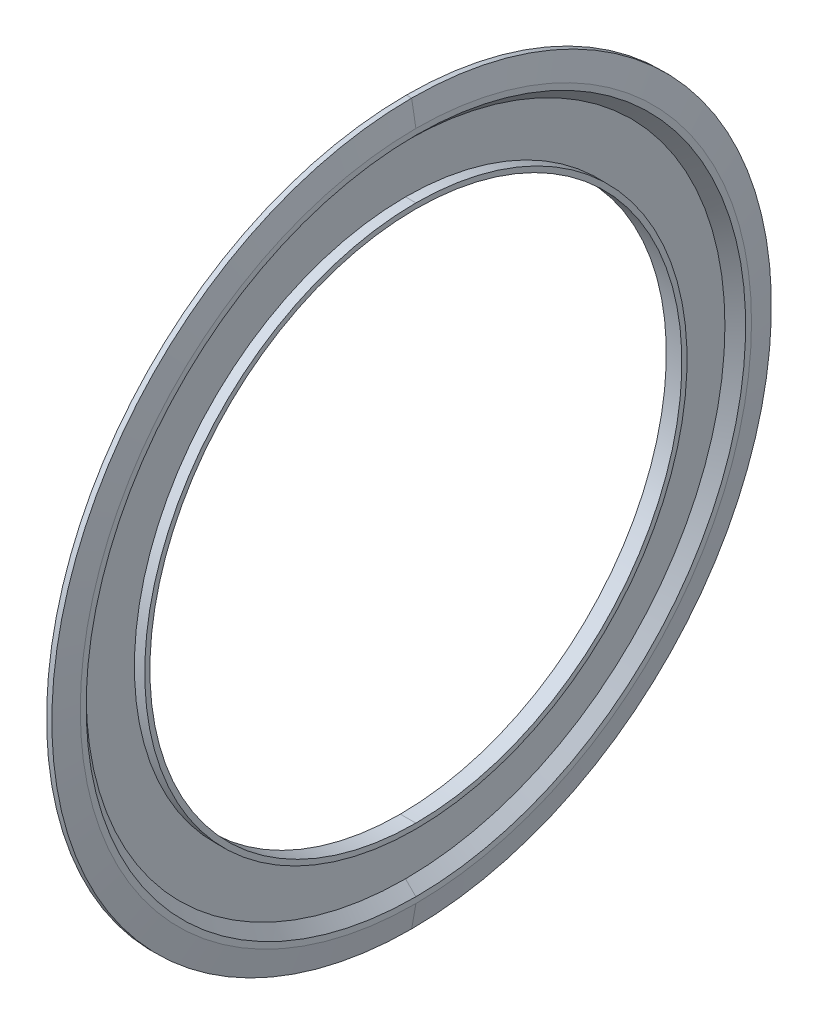
ISO-10303-21;
HEADER;
FILE_DESCRIPTION(('STEP AP214'),'2;1');
FILE_NAME('part.step','',(''),(''),'','','');
FILE_SCHEMA(('AUTOMOTIVE_DESIGN { 1 0 10303 214 1 1 1 1 }'));
ENDSEC;
DATA;
#1=APPLICATION_CONTEXT('core data for automotive mechanical design processes');
#2=APPLICATION_PROTOCOL_DEFINITION('international standard','automotive_design',2000,#1);
#3=PRODUCT_CONTEXT('',#1,'mechanical');
#4=PRODUCT('Part','Part','',(#3));
#5=PRODUCT_RELATED_PRODUCT_CATEGORY('part','',(#4));
#6=PRODUCT_DEFINITION_FORMATION('','',#4);
#7=PRODUCT_DEFINITION_CONTEXT('part definition',#1,'design');
#8=PRODUCT_DEFINITION('design','',#6,#7);
#9=PRODUCT_DEFINITION_SHAPE('','',#8);
#10=(LENGTH_UNIT() NAMED_UNIT(*) SI_UNIT(.MILLI.,.METRE.));
#11=(NAMED_UNIT(*) PLANE_ANGLE_UNIT() SI_UNIT($,.RADIAN.));
#12=(NAMED_UNIT(*) SI_UNIT($,.STERADIAN.) SOLID_ANGLE_UNIT());
#13=UNCERTAINTY_MEASURE_WITH_UNIT(LENGTH_MEASURE(1.E-05),#10,'distance_accuracy_value','');
#14=(GEOMETRIC_REPRESENTATION_CONTEXT(3) GLOBAL_UNCERTAINTY_ASSIGNED_CONTEXT((#13)) GLOBAL_UNIT_ASSIGNED_CONTEXT((#10,
#11,#12)) REPRESENTATION_CONTEXT('',''));
#15=CARTESIAN_POINT('',(0.,0.,0.));
#16=DIRECTION('',(0.,0.,1.));
#17=DIRECTION('',(1.,0.,0.));
#18=AXIS2_PLACEMENT_3D('',#15,#16,#17);
#19=CARTESIAN_POINT('',(1.32622244076363,21.783,0.));
#20=DIRECTION('',(1.,0.,0.));
#21=DIRECTION('',(0.,0.,1.));
#22=AXIS2_PLACEMENT_3D('',#19,#20,#21);
#23=PLANE('',#22);
#24=CARTESIAN_POINT('',(1.32622244076363,0.,0.));
#25=DIRECTION('',(-1.,0.,0.));
#26=DIRECTION('',(0.,1.,0.));
#27=AXIS2_PLACEMENT_3D('',#24,#25,#26);
#28=CIRCLE('',#27,21.591);
#29=CARTESIAN_POINT('',(1.32622244076363,21.591,0.));
#30=VERTEX_POINT('',#29);
#31=CARTESIAN_POINT('',(1.32622244076363,-21.591,0.));
#32=VERTEX_POINT('',#31);
#33=EDGE_CURVE('E11',#30,#32,#28,.T.);
#34=ORIENTED_EDGE('',*,*,#33,.T.);
#35=CARTESIAN_POINT('',(1.32622244076363,0.,0.));
#36=DIRECTION('',(-1.,0.,0.));
#37=DIRECTION('',(0.,1.,0.));
#38=AXIS2_PLACEMENT_3D('',#35,#36,#37);
#39=CIRCLE('',#38,21.591);
#40=EDGE_CURVE('E109',#32,#30,#39,.T.);
#41=ORIENTED_EDGE('',*,*,#40,.T.);
#42=EDGE_LOOP('',(#34,#41));
#43=FACE_BOUND('',#42,.T.);
#44=CARTESIAN_POINT('',(1.32622244076363,0.,0.));
#45=DIRECTION('',(-1.,0.,0.));
#46=DIRECTION('',(0.,1.,0.));
#47=AXIS2_PLACEMENT_3D('',#44,#45,#46);
#48=CIRCLE('',#47,21.975);
#49=CARTESIAN_POINT('',(1.32622244076363,21.975,0.));
#50=VERTEX_POINT('',#49);
#51=CARTESIAN_POINT('',(1.32622244076363,-21.975,0.));
#52=VERTEX_POINT('',#51);
#53=EDGE_CURVE('E191',#50,#52,#48,.T.);
#54=ORIENTED_EDGE('',*,*,#53,.F.);
#55=CARTESIAN_POINT('',(1.32622244076363,0.,0.));
#56=DIRECTION('',(-1.,0.,0.));
#57=DIRECTION('',(0.,1.,0.));
#58=AXIS2_PLACEMENT_3D('',#55,#56,#57);
#59=CIRCLE('',#58,21.975);
#60=EDGE_CURVE('E29',#52,#50,#59,.T.);
#61=ORIENTED_EDGE('',*,*,#60,.F.);
#62=EDGE_LOOP('',(#54,#61));
#63=FACE_BOUND('',#62,.T.);
#64=ADVANCED_FACE('F16',(#43,#63),#23,.T.);
#65=CARTESIAN_POINT('',(0.987222440763631,0.,0.));
#66=DIRECTION('',(1.,0.,0.));
#67=DIRECTION('',(0.,1.,0.));
#68=AXIS2_PLACEMENT_3D('',#65,#66,#67);
#69=CONICAL_SURFACE('',#68,21.252,0.785398163397448);
#70=DIRECTION('',(-0.707106781186548,-0.707106781186547,0.));
#71=VECTOR('',#70,1.);
#72=CARTESIAN_POINT('',(0.987222440763631,21.252,0.));
#73=LINE('',#72,#71);
#74=CARTESIAN_POINT('',(0.648222440763632,20.913,0.));
#75=VERTEX_POINT('',#74);
#76=EDGE_CURVE('E104',#30,#75,#73,.T.);
#77=ORIENTED_EDGE('',*,*,#76,.T.);
#78=CARTESIAN_POINT('',(0.648222440763632,0.,0.));
#79=DIRECTION('',(-1.,0.,0.));
#80=DIRECTION('',(0.,1.,0.));
#81=AXIS2_PLACEMENT_3D('',#78,#79,#80);
#82=CIRCLE('',#81,20.913);
#83=CARTESIAN_POINT('',(0.648222440763632,-20.913,0.));
#84=VERTEX_POINT('',#83);
#85=EDGE_CURVE('E23',#75,#84,#82,.T.);
#86=ORIENTED_EDGE('',*,*,#85,.T.);
#87=DIRECTION('',(0.707106781186548,-0.707106781186547,0.));
#88=VECTOR('',#87,1.);
#89=CARTESIAN_POINT('',(0.987222440763631,-21.252,0.));
#90=LINE('',#89,#88);
#91=EDGE_CURVE('E106',#84,#32,#90,.T.);
#92=ORIENTED_EDGE('',*,*,#91,.T.);
#93=ORIENTED_EDGE('',*,*,#33,.F.);
#94=EDGE_LOOP('',(#77,#86,#92,#93));
#95=FACE_BOUND('',#94,.T.);
#96=ADVANCED_FACE('F102',(#95),#69,.F.);
#97=CARTESIAN_POINT('',(0.648222440763631,19.3335,0.));
#98=DIRECTION('',(1.,0.,0.));
#99=DIRECTION('',(0.,-1.,0.));
#100=AXIS2_PLACEMENT_3D('',#97,#98,#99);
#101=PLANE('',#100);
#102=CARTESIAN_POINT('',(0.648222440763631,0.,0.));
#103=DIRECTION('',(-1.,0.,0.));
#104=DIRECTION('',(0.,1.,0.));
#105=AXIS2_PLACEMENT_3D('',#102,#103,#104);
#106=CIRCLE('',#105,17.754);
#107=CARTESIAN_POINT('',(0.648222440763631,17.754,0.));
#108=VERTEX_POINT('',#107);
#109=CARTESIAN_POINT('',(0.648222440763631,-17.754,0.));
#110=VERTEX_POINT('',#109);
#111=EDGE_CURVE('E159',#108,#110,#106,.T.);
#112=ORIENTED_EDGE('',*,*,#111,.T.);
#113=CARTESIAN_POINT('',(0.648222440763631,0.,0.));
#114=DIRECTION('',(-1.,0.,0.));
#115=DIRECTION('',(0.,1.,0.));
#116=AXIS2_PLACEMENT_3D('',#113,#114,#115);
#117=CIRCLE('',#116,17.754);
#118=EDGE_CURVE('E147',#110,#108,#117,.T.);
#119=ORIENTED_EDGE('',*,*,#118,.T.);
#120=EDGE_LOOP('',(#112,#119));
#121=FACE_BOUND('',#120,.T.);
#122=ORIENTED_EDGE('',*,*,#85,.F.);
#123=CARTESIAN_POINT('',(0.648222440763632,0.,0.));
#124=DIRECTION('',(-1.,0.,0.));
#125=DIRECTION('',(0.,1.,0.));
#126=AXIS2_PLACEMENT_3D('',#123,#124,#125);
#127=CIRCLE('',#126,20.913);
#128=EDGE_CURVE('E115',#84,#75,#127,.T.);
#129=ORIENTED_EDGE('',*,*,#128,.F.);
#130=EDGE_LOOP('',(#122,#129));
#131=FACE_BOUND('',#130,.T.);
#132=ADVANCED_FACE('F203',(#121,#131),#101,.T.);
#133=CARTESIAN_POINT('',(0.987222440763629,0.,0.));
#134=DIRECTION('',(-1.,0.,0.));
#135=DIRECTION('',(0.,1.,0.));
#136=AXIS2_PLACEMENT_3D('',#133,#134,#135);
#137=CYLINDRICAL_SURFACE('',#136,17.754);
#138=DIRECTION('',(-1.,0.,0.));
#139=VECTOR('',#138,1.);
#140=CARTESIAN_POINT('',(0.987222440763629,17.754,0.));
#141=LINE('',#140,#139);
#142=CARTESIAN_POINT('',(1.32622244076363,17.754,0.));
#143=VERTEX_POINT('',#142);
#144=EDGE_CURVE('E139',#143,#108,#141,.T.);
#145=ORIENTED_EDGE('',*,*,#144,.T.);
#146=ORIENTED_EDGE('',*,*,#118,.F.);
#147=DIRECTION('',(1.,0.,0.));
#148=VECTOR('',#147,1.);
#149=CARTESIAN_POINT('',(0.987222440763629,-17.754,0.));
#150=LINE('',#149,#148);
#151=CARTESIAN_POINT('',(1.32622244076363,-17.754,0.));
#152=VERTEX_POINT('',#151);
#153=EDGE_CURVE('E151',#110,#152,#150,.T.);
#154=ORIENTED_EDGE('',*,*,#153,.T.);
#155=CARTESIAN_POINT('',(1.32622244076363,0.,0.));
#156=DIRECTION('',(-1.,0.,0.));
#157=DIRECTION('',(0.,1.,0.));
#158=AXIS2_PLACEMENT_3D('',#155,#156,#157);
#159=CIRCLE('',#158,17.754);
#160=EDGE_CURVE('E145',#152,#143,#159,.T.);
#161=ORIENTED_EDGE('',*,*,#160,.T.);
#162=EDGE_LOOP('',(#145,#146,#154,#161));
#163=FACE_BOUND('',#162,.T.);
#164=ADVANCED_FACE('F205',(#163),#137,.T.);
#165=CARTESIAN_POINT('',(1.32622244076363,17.5845,0.));
#166=DIRECTION('',(1.,0.,0.));
#167=DIRECTION('',(0.,0.,1.));
#168=AXIS2_PLACEMENT_3D('',#165,#166,#167);
#169=PLANE('',#168);
#170=CARTESIAN_POINT('',(1.32622244076363,0.,0.));
#171=DIRECTION('',(-1.,0.,0.));
#172=DIRECTION('',(0.,1.,0.));
#173=AXIS2_PLACEMENT_3D('',#170,#171,#172);
#174=CIRCLE('',#173,17.415);
#175=CARTESIAN_POINT('',(1.32622244076363,17.415,0.));
#176=VERTEX_POINT('',#175);
#177=CARTESIAN_POINT('',(1.32622244076363,-17.415,0.));
#178=VERTEX_POINT('',#177);
#179=EDGE_CURVE('E148',#176,#178,#174,.T.);
#180=ORIENTED_EDGE('',*,*,#179,.T.);
#181=CARTESIAN_POINT('',(1.32622244076363,0.,0.));
#182=DIRECTION('',(-1.,0.,0.));
#183=DIRECTION('',(0.,1.,0.));
#184=AXIS2_PLACEMENT_3D('',#181,#182,#183);
#185=CIRCLE('',#184,17.415);
#186=EDGE_CURVE('E121',#178,#176,#185,.T.);
#187=ORIENTED_EDGE('',*,*,#186,.T.);
#188=EDGE_LOOP('',(#180,#187));
#189=FACE_BOUND('',#188,.T.);
#190=CARTESIAN_POINT('',(1.32622244076363,0.,0.));
#191=DIRECTION('',(-1.,0.,0.));
#192=DIRECTION('',(0.,1.,0.));
#193=AXIS2_PLACEMENT_3D('',#190,#191,#192);
#194=CIRCLE('',#193,17.754);
#195=EDGE_CURVE('E144',#143,#152,#194,.T.);
#196=ORIENTED_EDGE('',*,*,#195,.F.);
#197=ORIENTED_EDGE('',*,*,#160,.F.);
#198=EDGE_LOOP('',(#196,#197));
#199=FACE_BOUND('',#198,.T.);
#200=ADVANCED_FACE('F213',(#189,#199),#169,.T.);
#201=CARTESIAN_POINT('',(0.81772244076363,0.,0.));
#202=DIRECTION('',(-1.,0.,0.));
#203=DIRECTION('',(0.,1.,0.));
#204=AXIS2_PLACEMENT_3D('',#201,#202,#203);
#205=CYLINDRICAL_SURFACE('',#204,17.415);
#206=DIRECTION('',(-1.,0.,0.));
#207=VECTOR('',#206,1.);
#208=CARTESIAN_POINT('',(0.81772244076363,17.415,0.));
#209=LINE('',#208,#207);
#210=CARTESIAN_POINT('',(0.30922244076363,17.415,0.));
#211=VERTEX_POINT('',#210);
#212=EDGE_CURVE('E125',#176,#211,#209,.T.);
#213=ORIENTED_EDGE('',*,*,#212,.T.);
#214=CARTESIAN_POINT('',(0.30922244076363,0.,0.));
#215=DIRECTION('',(-1.,0.,0.));
#216=DIRECTION('',(0.,1.,0.));
#217=AXIS2_PLACEMENT_3D('',#214,#215,#216);
#218=CIRCLE('',#217,17.415);
#219=CARTESIAN_POINT('',(0.30922244076363,-17.415,0.));
#220=VERTEX_POINT('',#219);
#221=EDGE_CURVE('E200',#211,#220,#218,.T.);
#222=ORIENTED_EDGE('',*,*,#221,.T.);
#223=DIRECTION('',(1.,0.,0.));
#224=VECTOR('',#223,1.);
#225=CARTESIAN_POINT('',(0.81772244076363,-17.415,0.));
#226=LINE('',#225,#224);
#227=EDGE_CURVE('E124',#220,#178,#226,.T.);
#228=ORIENTED_EDGE('',*,*,#227,.T.);
#229=ORIENTED_EDGE('',*,*,#179,.F.);
#230=EDGE_LOOP('',(#213,#222,#228,#229));
#231=FACE_BOUND('',#230,.T.);
#232=ADVANCED_FACE('F247',(#231),#205,.F.);
#233=CARTESIAN_POINT('',(0.30922244076363,19.2342091988222,0.));
#234=DIRECTION('',(-1.,0.,0.));
#235=DIRECTION('',(0.,0.,1.));
#236=AXIS2_PLACEMENT_3D('',#233,#234,#235);
#237=PLANE('',#236);
#238=ORIENTED_EDGE('',*,*,#221,.F.);
#239=CARTESIAN_POINT('',(0.30922244076363,0.,0.));
#240=DIRECTION('',(-1.,0.,0.));
#241=DIRECTION('',(0.,1.,0.));
#242=AXIS2_PLACEMENT_3D('',#239,#240,#241);
#243=CIRCLE('',#242,17.415);
#244=EDGE_CURVE('E134',#220,#211,#243,.T.);
#245=ORIENTED_EDGE('',*,*,#244,.F.);
#246=EDGE_LOOP('',(#238,#245));
#247=FACE_BOUND('',#246,.T.);
#248=CARTESIAN_POINT('',(0.309222440763632,0.,0.));
#249=DIRECTION('',(-1.,0.,0.));
#250=DIRECTION('',(0.,1.,0.));
#251=AXIS2_PLACEMENT_3D('',#248,#249,#250);
#252=CIRCLE('',#251,21.0534183976445);
#253=CARTESIAN_POINT('',(0.309222440763632,21.0534183976445,0.));
#254=VERTEX_POINT('',#253);
#255=CARTESIAN_POINT('',(0.309222440763632,-21.0534183976445,0.));
#256=VERTEX_POINT('',#255);
#257=EDGE_CURVE('E162',#254,#256,#252,.T.);
#258=ORIENTED_EDGE('',*,*,#257,.T.);
#259=CARTESIAN_POINT('',(0.309222440763632,0.,0.));
#260=DIRECTION('',(-1.,0.,0.));
#261=DIRECTION('',(0.,1.,0.));
#262=AXIS2_PLACEMENT_3D('',#259,#260,#261);
#263=CIRCLE('',#262,21.0534183976445);
#264=EDGE_CURVE('E198',#256,#254,#263,.T.);
#265=ORIENTED_EDGE('',*,*,#264,.T.);
#266=EDGE_LOOP('',(#258,#265));
#267=FACE_BOUND('',#266,.T.);
#268=ADVANCED_FACE('F257',(#247,#267),#237,.T.);
#269=CARTESIAN_POINT('',(0.648222440763631,0.,0.));
#270=DIRECTION('',(1.,0.,0.));
#271=DIRECTION('',(0.,1.,0.));
#272=AXIS2_PLACEMENT_3D('',#269,#270,#271);
#273=CONICAL_SURFACE('',#272,21.3924183976445,0.785398163397445);
#274=DIRECTION('',(-0.70710678118655,-0.707106781186545,0.));
#275=VECTOR('',#274,1.);
#276=CARTESIAN_POINT('',(0.648222440763631,21.3924183976445,0.));
#277=LINE('',#276,#275);
#278=CARTESIAN_POINT('',(0.987222440763629,21.7314183976445,0.));
#279=VERTEX_POINT('',#278);
#280=EDGE_CURVE('E156',#279,#254,#277,.T.);
#281=ORIENTED_EDGE('',*,*,#280,.T.);
#282=ORIENTED_EDGE('',*,*,#264,.F.);
#283=DIRECTION('',(0.70710678118655,-0.707106781186545,0.));
#284=VECTOR('',#283,1.);
#285=CARTESIAN_POINT('',(0.648222440763631,-21.3924183976445,0.));
#286=LINE('',#285,#284);
#287=CARTESIAN_POINT('',(0.987222440763629,-21.7314183976445,0.));
#288=VERTEX_POINT('',#287);
#289=EDGE_CURVE('E155',#256,#288,#286,.T.);
#290=ORIENTED_EDGE('',*,*,#289,.T.);
#291=CARTESIAN_POINT('',(0.987222440763629,0.,0.));
#292=DIRECTION('',(-1.,0.,0.));
#293=DIRECTION('',(0.,1.,0.));
#294=AXIS2_PLACEMENT_3D('',#291,#292,#293);
#295=CIRCLE('',#294,21.7314183976445);
#296=EDGE_CURVE('E141',#288,#279,#295,.T.);
#297=ORIENTED_EDGE('',*,*,#296,.T.);
#298=EDGE_LOOP('',(#281,#282,#290,#297));
#299=FACE_BOUND('',#298,.T.);
#300=ADVANCED_FACE('F267',(#299),#273,.T.);
#301=CARTESIAN_POINT('',(0.987222440763629,21.8383798703546,0.));
#302=DIRECTION('',(-1.,0.,0.));
#303=DIRECTION('',(0.,0.,1.));
#304=AXIS2_PLACEMENT_3D('',#301,#302,#303);
#305=PLANE('',#304);
#306=CARTESIAN_POINT('',(0.987222440763629,0.,0.));
#307=DIRECTION('',(-1.,0.,0.));
#308=DIRECTION('',(0.,1.,0.));
#309=AXIS2_PLACEMENT_3D('',#306,#307,#308);
#310=CIRCLE('',#309,21.7314183976445);
#311=EDGE_CURVE('E152',#279,#288,#310,.T.);
#312=ORIENTED_EDGE('',*,*,#311,.F.);
#313=ORIENTED_EDGE('',*,*,#296,.F.);
#314=EDGE_LOOP('',(#312,#313));
#315=FACE_BOUND('',#314,.T.);
#316=CARTESIAN_POINT('',(0.987222440763629,0.,0.));
#317=DIRECTION('',(-1.,0.,0.));
#318=DIRECTION('',(0.,1.,0.));
#319=AXIS2_PLACEMENT_3D('',#316,#317,#318);
#320=CIRCLE('',#319,21.9453413430647);
#321=CARTESIAN_POINT('',(0.987222440763629,21.9453413430647,0.));
#322=VERTEX_POINT('',#321);
#323=CARTESIAN_POINT('',(0.987222440763629,-21.9453413430647,0.));
#324=VERTEX_POINT('',#323);
#325=EDGE_CURVE('E119',#322,#324,#320,.T.);
#326=ORIENTED_EDGE('',*,*,#325,.T.);
#327=CARTESIAN_POINT('',(0.987222440763629,0.,0.));
#328=DIRECTION('',(-1.,0.,0.));
#329=DIRECTION('',(0.,1.,0.));
#330=AXIS2_PLACEMENT_3D('',#327,#328,#329);
#331=CIRCLE('',#330,21.9453413430647);
#332=EDGE_CURVE('E179',#324,#322,#331,.T.);
#333=ORIENTED_EDGE('',*,*,#332,.T.);
#334=EDGE_LOOP('',(#326,#333));
#335=FACE_BOUND('',#334,.T.);
#336=ADVANCED_FACE('F277',(#315,#335),#305,.T.);
#337=CARTESIAN_POINT('',(0.845132988308601,0.,0.));
#338=DIRECTION('',(-1.,0.,0.));
#339=DIRECTION('',(0.,1.,0.));
#340=AXIS2_PLACEMENT_3D('',#337,#338,#339);
#341=CONICAL_SURFACE('',#340,22.7511706715324,1.39626340159546);
#342=DIRECTION('',(-0.17364817766693,0.984807753012208,0.));
#343=VECTOR('',#342,1.);
#344=CARTESIAN_POINT('',(0.845132988308601,22.7511706715324,0.));
#345=LINE('',#344,#343);
#346=CARTESIAN_POINT('',(0.70304353585357,23.557,0.));
#347=VERTEX_POINT('',#346);
#348=EDGE_CURVE('E176',#322,#347,#345,.T.);
#349=ORIENTED_EDGE('',*,*,#348,.T.);
#350=CARTESIAN_POINT('',(0.70304353585357,0.,0.));
#351=DIRECTION('',(-1.,0.,0.));
#352=DIRECTION('',(0.,1.,0.));
#353=AXIS2_PLACEMENT_3D('',#350,#351,#352);
#354=CIRCLE('',#353,23.557);
#355=CARTESIAN_POINT('',(0.70304353585357,-23.557,0.));
#356=VERTEX_POINT('',#355);
#357=EDGE_CURVE('E169',#347,#356,#354,.T.);
#358=ORIENTED_EDGE('',*,*,#357,.T.);
#359=DIRECTION('',(0.17364817766693,0.984807753012208,0.));
#360=VECTOR('',#359,1.);
#361=CARTESIAN_POINT('',(0.845132988308601,-22.7511706715324,0.));
#362=LINE('',#361,#360);
#363=EDGE_CURVE('E182',#356,#324,#362,.T.);
#364=ORIENTED_EDGE('',*,*,#363,.T.);
#365=ORIENTED_EDGE('',*,*,#325,.F.);
#366=EDGE_LOOP('',(#349,#358,#364,#365));
#367=FACE_BOUND('',#366,.T.);
#368=ADVANCED_FACE('F287',(#367),#341,.F.);
#369=CARTESIAN_POINT('',(0.875158346568204,0.,0.));
#370=DIRECTION('',(-1.,0.,0.));
#371=DIRECTION('',(0.,1.,0.));
#372=AXIS2_PLACEMENT_3D('',#369,#370,#371);
#373=CYLINDRICAL_SURFACE('',#372,23.557);
#374=DIRECTION('',(-1.,0.,0.));
#375=VECTOR('',#374,1.);
#376=CARTESIAN_POINT('',(0.875158346568204,23.557,0.));
#377=LINE('',#376,#375);
#378=CARTESIAN_POINT('',(1.04727315728284,23.557,0.));
#379=VERTEX_POINT('',#378);
#380=EDGE_CURVE('E126',#379,#347,#377,.T.);
#381=ORIENTED_EDGE('',*,*,#380,.T.);
#382=CARTESIAN_POINT('',(0.70304353585357,0.,0.));
#383=DIRECTION('',(-1.,0.,0.));
#384=DIRECTION('',(0.,1.,0.));
#385=AXIS2_PLACEMENT_3D('',#382,#383,#384);
#386=CIRCLE('',#385,23.557);
#387=EDGE_CURVE('E130',#356,#347,#386,.T.);
#388=ORIENTED_EDGE('',*,*,#387,.F.);
#389=DIRECTION('',(1.,0.,0.));
#390=VECTOR('',#389,1.);
#391=CARTESIAN_POINT('',(0.875158346568204,-23.557,0.));
#392=LINE('',#391,#390);
#393=CARTESIAN_POINT('',(1.04727315728284,-23.557,0.));
#394=VERTEX_POINT('',#393);
#395=EDGE_CURVE('E137',#356,#394,#392,.T.);
#396=ORIENTED_EDGE('',*,*,#395,.T.);
#397=CARTESIAN_POINT('',(1.04727315728284,0.,0.));
#398=DIRECTION('',(-1.,0.,0.));
#399=DIRECTION('',(0.,1.,0.));
#400=AXIS2_PLACEMENT_3D('',#397,#398,#399);
#401=CIRCLE('',#400,23.557);
#402=EDGE_CURVE('E120',#394,#379,#401,.T.);
#403=ORIENTED_EDGE('',*,*,#402,.T.);
#404=EDGE_LOOP('',(#381,#388,#396,#403));
#405=FACE_BOUND('',#404,.T.);
#406=ADVANCED_FACE('F297',(#405),#373,.T.);
#407=CARTESIAN_POINT('',(1.18674779902323,0.,0.));
#408=DIRECTION('',(-1.,0.,0.));
#409=DIRECTION('',(0.,1.,0.));
#410=AXIS2_PLACEMENT_3D('',#407,#408,#409);
#411=CONICAL_SURFACE('',#410,22.766,1.39626340159546);
#412=DIRECTION('',(-0.17364817766693,0.984807753012208,0.));
#413=VECTOR('',#412,1.);
#414=CARTESIAN_POINT('',(1.18674779902323,22.766,0.));
#415=LINE('',#414,#413);
#416=EDGE_CURVE('E171',#50,#379,#415,.T.);
#417=ORIENTED_EDGE('',*,*,#416,.T.);
#418=ORIENTED_EDGE('',*,*,#402,.F.);
#419=DIRECTION('',(0.17364817766693,0.984807753012208,0.));
#420=VECTOR('',#419,1.);
#421=CARTESIAN_POINT('',(1.18674779902323,-22.766,0.));
#422=LINE('',#421,#420);
#423=EDGE_CURVE('E194',#394,#52,#422,.T.);
#424=ORIENTED_EDGE('',*,*,#423,.T.);
#425=ORIENTED_EDGE('',*,*,#60,.T.);
#426=EDGE_LOOP('',(#417,#418,#424,#425));
#427=FACE_BOUND('',#426,.T.);
#428=ADVANCED_FACE('F307',(#427),#411,.T.);
#429=CARTESIAN_POINT('',(1.18674779902323,0.,0.));
#430=DIRECTION('',(-1.,0.,0.));
#431=DIRECTION('',(0.,1.,0.));
#432=AXIS2_PLACEMENT_3D('',#429,#430,#431);
#433=CONICAL_SURFACE('',#432,22.766,1.39626340159546);
#434=ORIENTED_EDGE('',*,*,#416,.F.);
#435=ORIENTED_EDGE('',*,*,#53,.T.);
#436=ORIENTED_EDGE('',*,*,#423,.F.);
#437=CARTESIAN_POINT('',(1.04727315728284,0.,0.));
#438=DIRECTION('',(-1.,0.,0.));
#439=DIRECTION('',(0.,1.,0.));
#440=AXIS2_PLACEMENT_3D('',#437,#438,#439);
#441=CIRCLE('',#440,23.557);
#442=EDGE_CURVE('E129',#379,#394,#441,.T.);
#443=ORIENTED_EDGE('',*,*,#442,.F.);
#444=EDGE_LOOP('',(#434,#435,#436,#443));
#445=FACE_BOUND('',#444,.T.);
#446=ADVANCED_FACE('F317',(#445),#433,.T.);
#447=CARTESIAN_POINT('',(0.875158346568204,0.,0.));
#448=DIRECTION('',(-1.,0.,0.));
#449=DIRECTION('',(0.,1.,0.));
#450=AXIS2_PLACEMENT_3D('',#447,#448,#449);
#451=CYLINDRICAL_SURFACE('',#450,23.557);
#452=ORIENTED_EDGE('',*,*,#380,.F.);
#453=ORIENTED_EDGE('',*,*,#442,.T.);
#454=ORIENTED_EDGE('',*,*,#395,.F.);
#455=ORIENTED_EDGE('',*,*,#357,.F.);
#456=EDGE_LOOP('',(#452,#453,#454,#455));
#457=FACE_BOUND('',#456,.T.);
#458=ADVANCED_FACE('F326',(#457),#451,.T.);
#459=CARTESIAN_POINT('',(0.845132988308601,0.,0.));
#460=DIRECTION('',(-1.,0.,0.));
#461=DIRECTION('',(0.,1.,0.));
#462=AXIS2_PLACEMENT_3D('',#459,#460,#461);
#463=CONICAL_SURFACE('',#462,22.7511706715324,1.39626340159546);
#464=ORIENTED_EDGE('',*,*,#348,.F.);
#465=ORIENTED_EDGE('',*,*,#332,.F.);
#466=ORIENTED_EDGE('',*,*,#363,.F.);
#467=ORIENTED_EDGE('',*,*,#387,.T.);
#468=EDGE_LOOP('',(#464,#465,#466,#467));
#469=FACE_BOUND('',#468,.T.);
#470=ADVANCED_FACE('F336',(#469),#463,.F.);
#471=CARTESIAN_POINT('',(0.648222440763631,0.,0.));
#472=DIRECTION('',(1.,0.,0.));
#473=DIRECTION('',(0.,1.,0.));
#474=AXIS2_PLACEMENT_3D('',#471,#472,#473);
#475=CONICAL_SURFACE('',#474,21.3924183976445,0.785398163397445);
#476=ORIENTED_EDGE('',*,*,#280,.F.);
#477=ORIENTED_EDGE('',*,*,#311,.T.);
#478=ORIENTED_EDGE('',*,*,#289,.F.);
#479=ORIENTED_EDGE('',*,*,#257,.F.);
#480=EDGE_LOOP('',(#476,#477,#478,#479));
#481=FACE_BOUND('',#480,.T.);
#482=ADVANCED_FACE('F346',(#481),#475,.T.);
#483=CARTESIAN_POINT('',(0.81772244076363,0.,0.));
#484=DIRECTION('',(-1.,0.,0.));
#485=DIRECTION('',(0.,1.,0.));
#486=AXIS2_PLACEMENT_3D('',#483,#484,#485);
#487=CYLINDRICAL_SURFACE('',#486,17.415);
#488=ORIENTED_EDGE('',*,*,#212,.F.);
#489=ORIENTED_EDGE('',*,*,#186,.F.);
#490=ORIENTED_EDGE('',*,*,#227,.F.);
#491=ORIENTED_EDGE('',*,*,#244,.T.);
#492=EDGE_LOOP('',(#488,#489,#490,#491));
#493=FACE_BOUND('',#492,.T.);
#494=ADVANCED_FACE('F356',(#493),#487,.F.);
#495=CARTESIAN_POINT('',(0.987222440763629,0.,0.));
#496=DIRECTION('',(-1.,0.,0.));
#497=DIRECTION('',(0.,1.,0.));
#498=AXIS2_PLACEMENT_3D('',#495,#496,#497);
#499=CYLINDRICAL_SURFACE('',#498,17.754);
#500=ORIENTED_EDGE('',*,*,#144,.F.);
#501=ORIENTED_EDGE('',*,*,#195,.T.);
#502=ORIENTED_EDGE('',*,*,#153,.F.);
#503=ORIENTED_EDGE('',*,*,#111,.F.);
#504=EDGE_LOOP('',(#500,#501,#502,#503));
#505=FACE_BOUND('',#504,.T.);
#506=ADVANCED_FACE('F366',(#505),#499,.T.);
#507=CARTESIAN_POINT('',(0.987222440763631,0.,0.));
#508=DIRECTION('',(1.,0.,0.));
#509=DIRECTION('',(0.,1.,0.));
#510=AXIS2_PLACEMENT_3D('',#507,#508,#509);
#511=CONICAL_SURFACE('',#510,21.252,0.785398163397448);
#512=ORIENTED_EDGE('',*,*,#76,.F.);
#513=ORIENTED_EDGE('',*,*,#40,.F.);
#514=ORIENTED_EDGE('',*,*,#91,.F.);
#515=ORIENTED_EDGE('',*,*,#128,.T.);
#516=EDGE_LOOP('',(#512,#513,#514,#515));
#517=FACE_BOUND('',#516,.T.);
#518=ADVANCED_FACE('F113',(#517),#511,.F.);
#519=CLOSED_SHELL('',(#64,#96,#132,#164,#200,#232,#268,#300,#336,#368,#406,#428,#446,#458,#470,
#482,#494,#506,#518));
#520=MANIFOLD_SOLID_BREP('B1',#519);
#521=ADVANCED_BREP_SHAPE_REPRESENTATION('',(#18,#520),#14);
#522=SHAPE_DEFINITION_REPRESENTATION(#9,#521);
ENDSEC;
END-ISO-10303-21;
